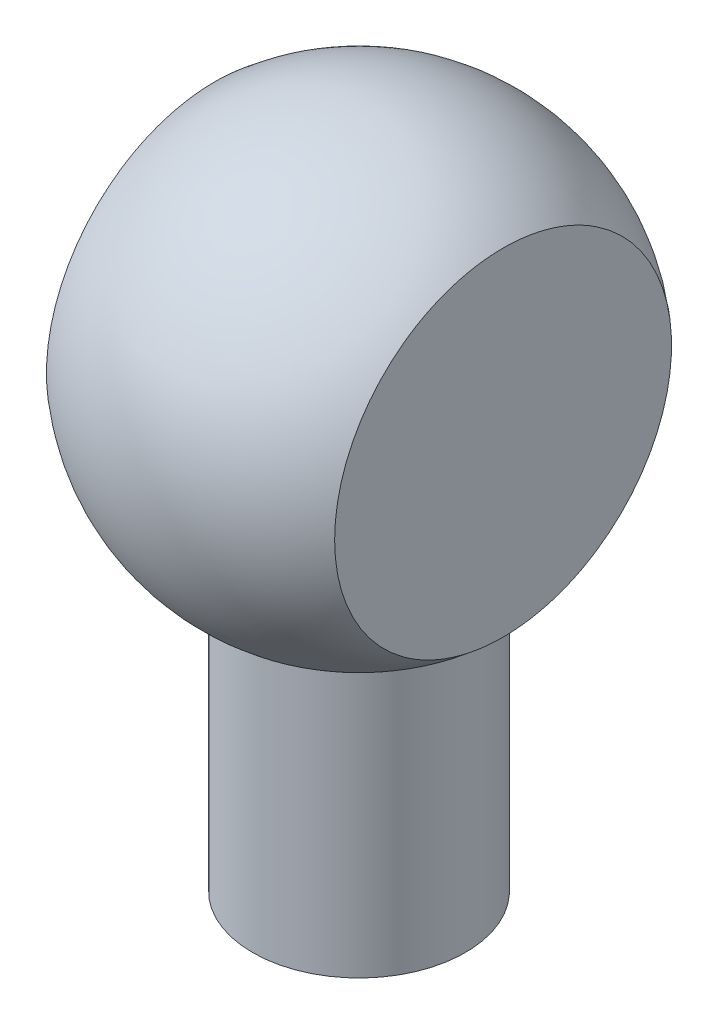
ISO-10303-21;
HEADER;
FILE_DESCRIPTION(('STEP AP214'),'2;1');
FILE_NAME('part.step','',(''),(''),'','','');
FILE_SCHEMA(('AUTOMOTIVE_DESIGN { 1 0 10303 214 1 1 1 1 }'));
ENDSEC;
DATA;
#1=APPLICATION_CONTEXT('core data for automotive mechanical design processes');
#2=APPLICATION_PROTOCOL_DEFINITION('international standard','automotive_design',2000,#1);
#3=PRODUCT_CONTEXT('',#1,'mechanical');
#4=PRODUCT('Part','Part','',(#3));
#5=PRODUCT_RELATED_PRODUCT_CATEGORY('part','',(#4));
#6=PRODUCT_DEFINITION_FORMATION('','',#4);
#7=PRODUCT_DEFINITION_CONTEXT('part definition',#1,'design');
#8=PRODUCT_DEFINITION('design','',#6,#7);
#9=PRODUCT_DEFINITION_SHAPE('','',#8);
#10=(LENGTH_UNIT() NAMED_UNIT(*) SI_UNIT(.MILLI.,.METRE.));
#11=(NAMED_UNIT(*) PLANE_ANGLE_UNIT() SI_UNIT($,.RADIAN.));
#12=(NAMED_UNIT(*) SI_UNIT($,.STERADIAN.) SOLID_ANGLE_UNIT());
#13=UNCERTAINTY_MEASURE_WITH_UNIT(LENGTH_MEASURE(1.E-05),#10,'distance_accuracy_value','');
#14=(GEOMETRIC_REPRESENTATION_CONTEXT(3) GLOBAL_UNCERTAINTY_ASSIGNED_CONTEXT((#13)) GLOBAL_UNIT_ASSIGNED_CONTEXT((#10,
#11,#12)) REPRESENTATION_CONTEXT('',''));
#15=CARTESIAN_POINT('',(0.,0.,0.));
#16=DIRECTION('',(0.,0.,1.));
#17=DIRECTION('',(1.,0.,0.));
#18=AXIS2_PLACEMENT_3D('',#15,#16,#17);
#19=CARTESIAN_POINT('',(0.,0.,0.));
#20=DIRECTION('',(0.,-1.,0.));
#21=DIRECTION('',(0.,0.,-1.));
#22=AXIS2_PLACEMENT_3D('',#19,#20,#21);
#23=PLANE('',#22);
#24=CARTESIAN_POINT('',(0.,0.,0.));
#25=DIRECTION('',(0.,1.,0.));
#26=DIRECTION('',(0.,0.,1.));
#27=AXIS2_PLACEMENT_3D('',#24,#25,#26);
#28=CIRCLE('',#27,4.8);
#29=CARTESIAN_POINT('',(0.,0.,4.8));
#30=VERTEX_POINT('',#29);
#31=EDGE_CURVE('E10',#30,#30,#28,.T.);
#32=ORIENTED_EDGE('',*,*,#31,.F.);
#33=EDGE_LOOP('',(#32));
#34=FACE_BOUND('',#33,.T.);
#35=ADVANCED_FACE('F30',(#34),#23,.T.);
#36=CARTESIAN_POINT('',(0.,20.7726848797845,0.));
#37=DIRECTION('',(0.,1.,0.));
#38=DIRECTION('',(0.,0.,1.));
#39=AXIS2_PLACEMENT_3D('',#36,#37,#38);
#40=CYLINDRICAL_SURFACE('',#39,4.8);
#41=ORIENTED_EDGE('',*,*,#31,.T.);
#42=EDGE_LOOP('',(#41));
#43=FACE_BOUND('',#42,.T.);
#44=CARTESIAN_POINT('',(0.,12.,0.));
#45=DIRECTION('',(0.,1.,0.));
#46=DIRECTION('',(0.,0.,1.));
#47=AXIS2_PLACEMENT_3D('',#44,#45,#46);
#48=CIRCLE('',#47,4.8);
#49=CARTESIAN_POINT('',(0.,12.,4.8));
#50=VERTEX_POINT('',#49);
#51=EDGE_CURVE('E37',#50,#50,#48,.T.);
#52=ORIENTED_EDGE('',*,*,#51,.F.);
#53=EDGE_LOOP('',(#52));
#54=FACE_BOUND('',#53,.T.);
#55=ADVANCED_FACE('F56',(#43,#54),#40,.T.);
#56=CARTESIAN_POINT('',(0.,20.7726848797845,0.));
#57=DIRECTION('',(0.,1.,0.));
#58=DIRECTION('',(0.,0.,1.));
#59=AXIS2_PLACEMENT_3D('',#56,#57,#58);
#60=SPHERICAL_SURFACE('',#59,10.);
#61=CARTESIAN_POINT('',(-6.5,20.7726848797845,0.));
#62=DIRECTION('',(1.,0.,0.));
#63=DIRECTION('',(0.,0.,-1.));
#64=AXIS2_PLACEMENT_3D('',#61,#62,#63);
#65=CIRCLE('',#64,7.59934207678533);
#66=CARTESIAN_POINT('',(-6.5,20.7726848797845,-7.59934207678533));
#67=VERTEX_POINT('',#66);
#68=EDGE_CURVE('E33',#67,#67,#65,.F.);
#69=ORIENTED_EDGE('',*,*,#68,.F.);
#70=EDGE_LOOP('',(#69));
#71=FACE_BOUND('',#70,.T.);
#72=CARTESIAN_POINT('',(6.5,20.7726848797845,0.));
#73=DIRECTION('',(-1.,0.,0.));
#74=DIRECTION('',(0.,0.,1.));
#75=AXIS2_PLACEMENT_3D('',#72,#73,#74);
#76=CIRCLE('',#75,7.59934207678533);
#77=CARTESIAN_POINT('',(6.5,20.7726848797845,7.59934207678533));
#78=VERTEX_POINT('',#77);
#79=EDGE_CURVE('E43',#78,#78,#76,.F.);
#80=ORIENTED_EDGE('',*,*,#79,.F.);
#81=EDGE_LOOP('',(#80));
#82=FACE_BOUND('',#81,.T.);
#83=ORIENTED_EDGE('',*,*,#51,.T.);
#84=EDGE_LOOP('',(#83));
#85=FACE_BOUND('',#84,.T.);
#86=ADVANCED_FACE('F52',(#71,#82,#85),#60,.T.);
#87=CARTESIAN_POINT('',(6.5,12.,-11.6595866413703));
#88=DIRECTION('',(-1.,0.,0.));
#89=DIRECTION('',(0.,0.,1.));
#90=AXIS2_PLACEMENT_3D('',#87,#88,#89);
#91=PLANE('',#90);
#92=ORIENTED_EDGE('',*,*,#79,.T.);
#93=EDGE_LOOP('',(#92));
#94=FACE_BOUND('',#93,.T.);
#95=ADVANCED_FACE('F55',(#94),#91,.F.);
#96=CARTESIAN_POINT('',(-6.5,12.,-11.6595866413703));
#97=DIRECTION('',(1.,0.,0.));
#98=DIRECTION('',(0.,0.,-1.));
#99=AXIS2_PLACEMENT_3D('',#96,#97,#98);
#100=PLANE('',#99);
#101=ORIENTED_EDGE('',*,*,#68,.T.);
#102=EDGE_LOOP('',(#101));
#103=FACE_BOUND('',#102,.T.);
#104=ADVANCED_FACE('F50',(#103),#100,.F.);
#105=CLOSED_SHELL('',(#35,#55,#86,#95,#104));
#106=MANIFOLD_SOLID_BREP('B2',#105);
#107=ADVANCED_BREP_SHAPE_REPRESENTATION('',(#18,#106),#14);
#108=SHAPE_DEFINITION_REPRESENTATION(#9,#107);
ENDSEC;
END-ISO-10303-21;
